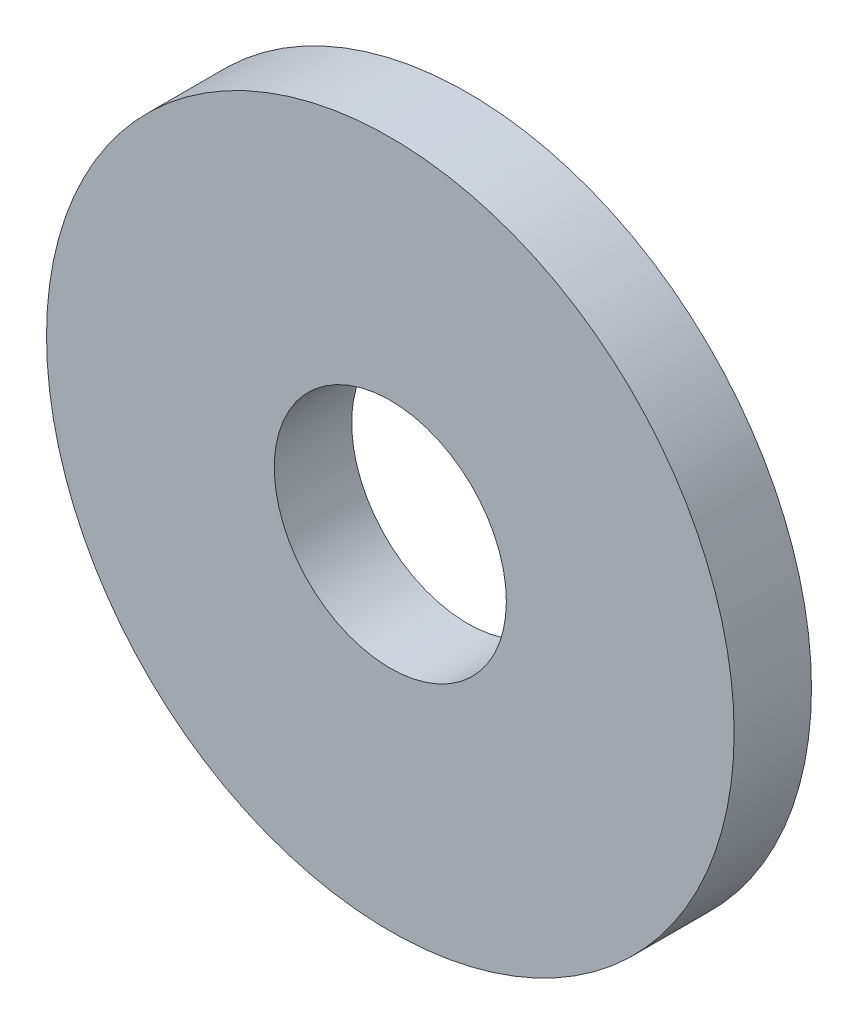
ISO-10303-21;
HEADER;
FILE_DESCRIPTION(('STEP AP214'),'2;1');
FILE_NAME('part.step','',(''),(''),'','','');
FILE_SCHEMA(('AUTOMOTIVE_DESIGN { 1 0 10303 214 1 1 1 1 }'));
ENDSEC;
DATA;
#1=APPLICATION_CONTEXT('core data for automotive mechanical design processes');
#2=APPLICATION_PROTOCOL_DEFINITION('international standard','automotive_design',2000,#1);
#3=PRODUCT_CONTEXT('',#1,'mechanical');
#4=PRODUCT('Part','Part','',(#3));
#5=PRODUCT_RELATED_PRODUCT_CATEGORY('part','',(#4));
#6=PRODUCT_DEFINITION_FORMATION('','',#4);
#7=PRODUCT_DEFINITION_CONTEXT('part definition',#1,'design');
#8=PRODUCT_DEFINITION('design','',#6,#7);
#9=PRODUCT_DEFINITION_SHAPE('','',#8);
#10=(LENGTH_UNIT() NAMED_UNIT(*) SI_UNIT(.MILLI.,.METRE.));
#11=(NAMED_UNIT(*) PLANE_ANGLE_UNIT() SI_UNIT($,.RADIAN.));
#12=(NAMED_UNIT(*) SI_UNIT($,.STERADIAN.) SOLID_ANGLE_UNIT());
#13=UNCERTAINTY_MEASURE_WITH_UNIT(LENGTH_MEASURE(1.E-05),#10,'distance_accuracy_value','');
#14=(GEOMETRIC_REPRESENTATION_CONTEXT(3) GLOBAL_UNCERTAINTY_ASSIGNED_CONTEXT((#13)) GLOBAL_UNIT_ASSIGNED_CONTEXT((#10,
#11,#12)) REPRESENTATION_CONTEXT('',''));
#15=CARTESIAN_POINT('',(0.,0.,0.));
#16=DIRECTION('',(0.,0.,1.));
#17=DIRECTION('',(1.,0.,0.));
#18=AXIS2_PLACEMENT_3D('',#15,#16,#17);
#19=CARTESIAN_POINT('',(0.,0.,0.9));
#20=DIRECTION('',(0.,0.,1.));
#21=DIRECTION('',(1.,0.,0.));
#22=AXIS2_PLACEMENT_3D('',#19,#20,#21);
#23=PLANE('',#22);
#24=CARTESIAN_POINT('',(0.,0.,0.9));
#25=DIRECTION('',(0.,0.,1.));
#26=DIRECTION('',(1.,0.,0.));
#27=AXIS2_PLACEMENT_3D('',#24,#25,#26);
#28=CIRCLE('',#27,4.);
#29=CARTESIAN_POINT('',(4.,0.,0.9));
#30=VERTEX_POINT('',#29);
#31=EDGE_CURVE('E10',#30,#30,#28,.T.);
#32=ORIENTED_EDGE('',*,*,#31,.T.);
#33=EDGE_LOOP('',(#32));
#34=FACE_BOUND('',#33,.T.);
#35=CARTESIAN_POINT('',(0.,0.,0.9));
#36=DIRECTION('',(0.,0.,1.));
#37=DIRECTION('',(1.,0.,0.));
#38=AXIS2_PLACEMENT_3D('',#35,#36,#37);
#39=CIRCLE('',#38,1.35);
#40=CARTESIAN_POINT('',(1.35,0.,0.9));
#41=VERTEX_POINT('',#40);
#42=EDGE_CURVE('E44',#41,#41,#39,.T.);
#43=ORIENTED_EDGE('',*,*,#42,.F.);
#44=EDGE_LOOP('',(#43));
#45=FACE_BOUND('',#44,.T.);
#46=ADVANCED_FACE('F33',(#34,#45),#23,.T.);
#47=CARTESIAN_POINT('',(0.,0.,0.));
#48=DIRECTION('',(0.,0.,1.));
#49=DIRECTION('',(1.,0.,0.));
#50=AXIS2_PLACEMENT_3D('',#47,#48,#49);
#51=PLANE('',#50);
#52=CARTESIAN_POINT('',(0.,0.,0.));
#53=DIRECTION('',(0.,0.,1.));
#54=DIRECTION('',(1.,0.,0.));
#55=AXIS2_PLACEMENT_3D('',#52,#53,#54);
#56=CIRCLE('',#55,4.);
#57=CARTESIAN_POINT('',(4.,0.,0.));
#58=VERTEX_POINT('',#57);
#59=EDGE_CURVE('E37',#58,#58,#56,.T.);
#60=ORIENTED_EDGE('',*,*,#59,.F.);
#61=EDGE_LOOP('',(#60));
#62=FACE_BOUND('',#61,.T.);
#63=CARTESIAN_POINT('',(0.,0.,0.));
#64=DIRECTION('',(0.,0.,1.));
#65=DIRECTION('',(1.,0.,0.));
#66=AXIS2_PLACEMENT_3D('',#63,#64,#65);
#67=CIRCLE('',#66,1.35);
#68=CARTESIAN_POINT('',(1.35,0.,0.));
#69=VERTEX_POINT('',#68);
#70=EDGE_CURVE('E46',#69,#69,#67,.T.);
#71=ORIENTED_EDGE('',*,*,#70,.T.);
#72=EDGE_LOOP('',(#71));
#73=FACE_BOUND('',#72,.T.);
#74=ADVANCED_FACE('F56',(#62,#73),#51,.F.);
#75=CARTESIAN_POINT('',(0.,0.,0.9));
#76=DIRECTION('',(0.,0.,-1.));
#77=DIRECTION('',(-1.,0.,0.));
#78=AXIS2_PLACEMENT_3D('',#75,#76,#77);
#79=CYLINDRICAL_SURFACE('',#78,4.);
#80=ORIENTED_EDGE('',*,*,#31,.F.);
#81=EDGE_LOOP('',(#80));
#82=FACE_BOUND('',#81,.T.);
#83=ORIENTED_EDGE('',*,*,#59,.T.);
#84=EDGE_LOOP('',(#83));
#85=FACE_BOUND('',#84,.T.);
#86=ADVANCED_FACE('F35',(#82,#85),#79,.T.);
#87=CARTESIAN_POINT('',(0.,0.,0.9));
#88=DIRECTION('',(0.,0.,-1.));
#89=DIRECTION('',(-1.,0.,0.));
#90=AXIS2_PLACEMENT_3D('',#87,#88,#89);
#91=CYLINDRICAL_SURFACE('',#90,1.35);
#92=ORIENTED_EDGE('',*,*,#42,.T.);
#93=EDGE_LOOP('',(#92));
#94=FACE_BOUND('',#93,.T.);
#95=ORIENTED_EDGE('',*,*,#70,.F.);
#96=EDGE_LOOP('',(#95));
#97=FACE_BOUND('',#96,.T.);
#98=ADVANCED_FACE('F52',(#94,#97),#91,.F.);
#99=CLOSED_SHELL('',(#46,#74,#86,#98));
#100=MANIFOLD_SOLID_BREP('B2',#99);
#101=ADVANCED_BREP_SHAPE_REPRESENTATION('',(#18,#100),#14);
#102=SHAPE_DEFINITION_REPRESENTATION(#9,#101);
ENDSEC;
END-ISO-10303-21;
